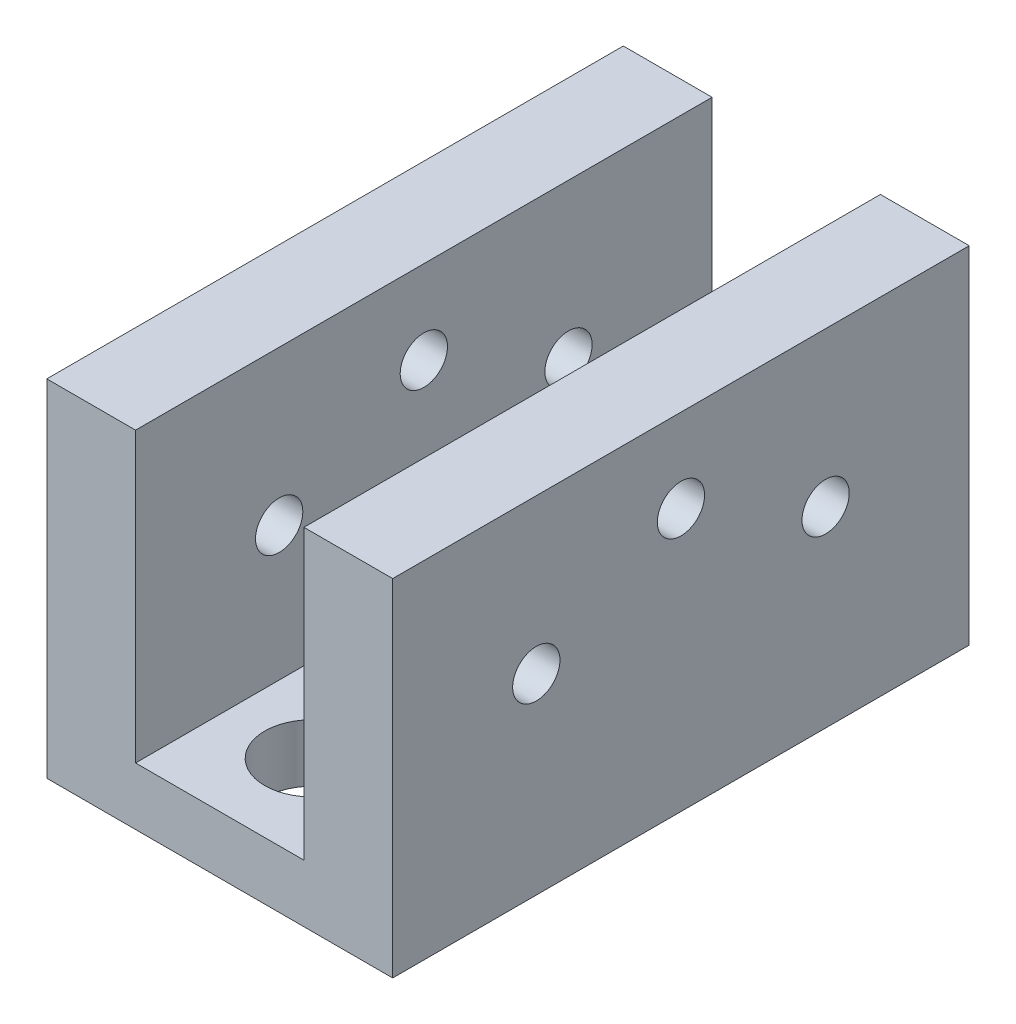
ISO-10303-21;
HEADER;
FILE_DESCRIPTION(('STEP AP214'),'2;1');
FILE_NAME('part.step','',(''),(''),'','','');
FILE_SCHEMA(('AUTOMOTIVE_DESIGN { 1 0 10303 214 1 1 1 1 }'));
ENDSEC;
DATA;
#1=APPLICATION_CONTEXT('core data for automotive mechanical design processes');
#2=APPLICATION_PROTOCOL_DEFINITION('international standard','automotive_design',2000,#1);
#3=PRODUCT_CONTEXT('',#1,'mechanical');
#4=PRODUCT('Part','Part','',(#3));
#5=PRODUCT_RELATED_PRODUCT_CATEGORY('part','',(#4));
#6=PRODUCT_DEFINITION_FORMATION('','',#4);
#7=PRODUCT_DEFINITION_CONTEXT('part definition',#1,'design');
#8=PRODUCT_DEFINITION('design','',#6,#7);
#9=PRODUCT_DEFINITION_SHAPE('','',#8);
#10=(LENGTH_UNIT() NAMED_UNIT(*) SI_UNIT(.MILLI.,.METRE.));
#11=(NAMED_UNIT(*) PLANE_ANGLE_UNIT() SI_UNIT($,.RADIAN.));
#12=(NAMED_UNIT(*) SI_UNIT($,.STERADIAN.) SOLID_ANGLE_UNIT());
#13=UNCERTAINTY_MEASURE_WITH_UNIT(LENGTH_MEASURE(1.E-05),#10,'distance_accuracy_value','');
#14=(GEOMETRIC_REPRESENTATION_CONTEXT(3) GLOBAL_UNCERTAINTY_ASSIGNED_CONTEXT((#13)) GLOBAL_UNIT_ASSIGNED_CONTEXT((#10,
#11,#12)) REPRESENTATION_CONTEXT('',''));
#15=CARTESIAN_POINT('',(0.,0.,0.));
#16=DIRECTION('',(0.,0.,1.));
#17=DIRECTION('',(1.,0.,0.));
#18=AXIS2_PLACEMENT_3D('',#15,#16,#17);
#19=CARTESIAN_POINT('',(0.,30.,0.));
#20=DIRECTION('',(0.,-1.,0.));
#21=DIRECTION('',(0.,0.,-1.));
#22=AXIS2_PLACEMENT_3D('',#19,#20,#21);
#23=PLANE('',#22);
#24=DIRECTION('',(-1.,0.,0.));
#25=VECTOR('',#24,1.);
#26=CARTESIAN_POINT('',(15.,30.,-25.));
#27=LINE('',#26,#25);
#28=CARTESIAN_POINT('',(15.,30.,-25.));
#29=VERTEX_POINT('',#28);
#30=CARTESIAN_POINT('',(7.3,30.,-25.));
#31=VERTEX_POINT('',#30);
#32=EDGE_CURVE('E219',#29,#31,#27,.T.);
#33=ORIENTED_EDGE('',*,*,#32,.T.);
#34=DIRECTION('',(0.,0.,-1.));
#35=VECTOR('',#34,1.);
#36=CARTESIAN_POINT('',(7.3,30.,25.));
#37=LINE('',#36,#35);
#38=CARTESIAN_POINT('',(7.3,30.,25.));
#39=VERTEX_POINT('',#38);
#40=EDGE_CURVE('E135',#39,#31,#37,.T.);
#41=ORIENTED_EDGE('',*,*,#40,.F.);
#42=DIRECTION('',(1.,0.,0.));
#43=VECTOR('',#42,1.);
#44=CARTESIAN_POINT('',(15.,30.,25.));
#45=LINE('',#44,#43);
#46=CARTESIAN_POINT('',(15.,30.,25.));
#47=VERTEX_POINT('',#46);
#48=EDGE_CURVE('E212',#39,#47,#45,.T.);
#49=ORIENTED_EDGE('',*,*,#48,.T.);
#50=DIRECTION('',(0.,0.,-1.));
#51=VECTOR('',#50,1.);
#52=CARTESIAN_POINT('',(15.,30.,-25.));
#53=LINE('',#52,#51);
#54=EDGE_CURVE('E215',#47,#29,#53,.T.);
#55=ORIENTED_EDGE('',*,*,#54,.T.);
#56=EDGE_LOOP('',(#33,#41,#49,#55));
#57=FACE_BOUND('',#56,.T.);
#58=ADVANCED_FACE('F45',(#57),#23,.F.);
#59=CARTESIAN_POINT('',(-15.,22.755,0.));
#60=DIRECTION('',(1.,0.,0.));
#61=DIRECTION('',(0.,0.,-1.));
#62=AXIS2_PLACEMENT_3D('',#59,#60,#61);
#63=CYLINDRICAL_SURFACE('',#62,2.05);
#64=CARTESIAN_POINT('',(7.3,22.755,0.));
#65=DIRECTION('',(1.,0.,0.));
#66=DIRECTION('',(0.,0.,-1.));
#67=AXIS2_PLACEMENT_3D('',#64,#65,#66);
#68=CIRCLE('',#67,2.05);
#69=CARTESIAN_POINT('',(7.3,22.755,-2.05));
#70=VERTEX_POINT('',#69);
#71=EDGE_CURVE('E49',#70,#70,#68,.F.);
#72=ORIENTED_EDGE('',*,*,#71,.T.);
#73=EDGE_LOOP('',(#72));
#74=FACE_BOUND('',#73,.T.);
#75=CARTESIAN_POINT('',(15.,22.755,0.));
#76=DIRECTION('',(1.,0.,0.));
#77=DIRECTION('',(0.,0.,-1.));
#78=AXIS2_PLACEMENT_3D('',#75,#76,#77);
#79=CIRCLE('',#78,2.05);
#80=CARTESIAN_POINT('',(15.,22.755,-2.05));
#81=VERTEX_POINT('',#80);
#82=EDGE_CURVE('E195',#81,#81,#79,.T.);
#83=ORIENTED_EDGE('',*,*,#82,.T.);
#84=EDGE_LOOP('',(#83));
#85=FACE_BOUND('',#84,.T.);
#86=ADVANCED_FACE('F322',(#74,#85),#63,.F.);
#87=CARTESIAN_POINT('',(0.,5.,0.));
#88=DIRECTION('',(0.,-1.,0.));
#89=DIRECTION('',(0.,0.,-1.));
#90=AXIS2_PLACEMENT_3D('',#87,#88,#89);
#91=PLANE('',#90);
#92=DIRECTION('',(-1.,0.,0.));
#93=VECTOR('',#92,1.);
#94=CARTESIAN_POINT('',(-15.,5.,-25.));
#95=LINE('',#94,#93);
#96=CARTESIAN_POINT('',(7.3,5.,-25.));
#97=VERTEX_POINT('',#96);
#98=CARTESIAN_POINT('',(-7.3,5.,-25.));
#99=VERTEX_POINT('',#98);
#100=EDGE_CURVE('E115',#97,#99,#95,.T.);
#101=ORIENTED_EDGE('',*,*,#100,.T.);
#102=DIRECTION('',(0.,0.,1.));
#103=VECTOR('',#102,1.);
#104=CARTESIAN_POINT('',(-7.3,5.,25.));
#105=LINE('',#104,#103);
#106=CARTESIAN_POINT('',(-7.3,5.,25.));
#107=VERTEX_POINT('',#106);
#108=EDGE_CURVE('E137',#99,#107,#105,.T.);
#109=ORIENTED_EDGE('',*,*,#108,.T.);
#110=DIRECTION('',(1.,0.,0.));
#111=VECTOR('',#110,1.);
#112=CARTESIAN_POINT('',(-15.,5.,25.));
#113=LINE('',#112,#111);
#114=CARTESIAN_POINT('',(7.3,5.,25.));
#115=VERTEX_POINT('',#114);
#116=EDGE_CURVE('E126',#107,#115,#113,.T.);
#117=ORIENTED_EDGE('',*,*,#116,.T.);
#118=DIRECTION('',(0.,0.,-1.));
#119=VECTOR('',#118,1.);
#120=CARTESIAN_POINT('',(7.3,5.,25.));
#121=LINE('',#120,#119);
#122=EDGE_CURVE('E132',#115,#97,#121,.T.);
#123=ORIENTED_EDGE('',*,*,#122,.T.);
#124=EDGE_LOOP('',(#101,#109,#117,#123));
#125=FACE_BOUND('',#124,.T.);
#126=CARTESIAN_POINT('',(0.,5.,17.));
#127=DIRECTION('',(0.,1.,0.));
#128=DIRECTION('',(0.,0.,1.));
#129=AXIS2_PLACEMENT_3D('',#126,#127,#128);
#130=CIRCLE('',#129,4.1);
#131=CARTESIAN_POINT('',(0.,5.,21.1));
#132=VERTEX_POINT('',#131);
#133=EDGE_CURVE('E223',#132,#132,#130,.T.);
#134=ORIENTED_EDGE('',*,*,#133,.F.);
#135=EDGE_LOOP('',(#134));
#136=FACE_BOUND('',#135,.T.);
#137=CARTESIAN_POINT('',(0.,5.,-17.));
#138=DIRECTION('',(0.,1.,0.));
#139=DIRECTION('',(0.,0.,1.));
#140=AXIS2_PLACEMENT_3D('',#137,#138,#139);
#141=CIRCLE('',#140,4.1);
#142=CARTESIAN_POINT('',(0.,5.,-12.9));
#143=VERTEX_POINT('',#142);
#144=EDGE_CURVE('E231',#143,#143,#141,.T.);
#145=ORIENTED_EDGE('',*,*,#144,.F.);
#146=EDGE_LOOP('',(#145));
#147=FACE_BOUND('',#146,.T.);
#148=ADVANCED_FACE('F139',(#125,#136,#147),#91,.F.);
#149=CARTESIAN_POINT('',(0.,0.,0.));
#150=DIRECTION('',(0.,-1.,0.));
#151=DIRECTION('',(0.,0.,-1.));
#152=AXIS2_PLACEMENT_3D('',#149,#150,#151);
#153=PLANE('',#152);
#154=CARTESIAN_POINT('',(0.,0.,-17.));
#155=DIRECTION('',(0.,1.,0.));
#156=DIRECTION('',(0.,0.,1.));
#157=AXIS2_PLACEMENT_3D('',#154,#155,#156);
#158=CIRCLE('',#157,4.1);
#159=CARTESIAN_POINT('',(0.,0.,-12.9));
#160=VERTEX_POINT('',#159);
#161=EDGE_CURVE('E227',#160,#160,#158,.T.);
#162=ORIENTED_EDGE('',*,*,#161,.T.);
#163=EDGE_LOOP('',(#162));
#164=FACE_BOUND('',#163,.T.);
#165=DIRECTION('',(0.,0.,-1.));
#166=VECTOR('',#165,1.);
#167=CARTESIAN_POINT('',(15.,0.,25.));
#168=LINE('',#167,#166);
#169=CARTESIAN_POINT('',(15.,0.,25.));
#170=VERTEX_POINT('',#169);
#171=CARTESIAN_POINT('',(15.,0.,-25.));
#172=VERTEX_POINT('',#171);
#173=EDGE_CURVE('E235',#170,#172,#168,.T.);
#174=ORIENTED_EDGE('',*,*,#173,.F.);
#175=DIRECTION('',(1.,0.,0.));
#176=VECTOR('',#175,1.);
#177=CARTESIAN_POINT('',(-15.,0.,25.));
#178=LINE('',#177,#176);
#179=CARTESIAN_POINT('',(-15.,0.,25.));
#180=VERTEX_POINT('',#179);
#181=EDGE_CURVE('E71',#180,#170,#178,.T.);
#182=ORIENTED_EDGE('',*,*,#181,.F.);
#183=DIRECTION('',(0.,0.,1.));
#184=VECTOR('',#183,1.);
#185=CARTESIAN_POINT('',(-15.,0.,25.));
#186=LINE('',#185,#184);
#187=CARTESIAN_POINT('',(-15.,0.,-25.));
#188=VERTEX_POINT('',#187);
#189=EDGE_CURVE('E248',#188,#180,#186,.T.);
#190=ORIENTED_EDGE('',*,*,#189,.F.);
#191=DIRECTION('',(-1.,0.,0.));
#192=VECTOR('',#191,1.);
#193=CARTESIAN_POINT('',(-15.,0.,-25.));
#194=LINE('',#193,#192);
#195=EDGE_CURVE('E245',#172,#188,#194,.T.);
#196=ORIENTED_EDGE('',*,*,#195,.F.);
#197=EDGE_LOOP('',(#174,#182,#190,#196));
#198=FACE_BOUND('',#197,.T.);
#199=CARTESIAN_POINT('',(0.,0.,17.));
#200=DIRECTION('',(0.,1.,0.));
#201=DIRECTION('',(0.,0.,1.));
#202=AXIS2_PLACEMENT_3D('',#199,#200,#201);
#203=CIRCLE('',#202,4.1);
#204=CARTESIAN_POINT('',(0.,0.,21.1));
#205=VERTEX_POINT('',#204);
#206=EDGE_CURVE('E222',#205,#205,#203,.T.);
#207=ORIENTED_EDGE('',*,*,#206,.T.);
#208=EDGE_LOOP('',(#207));
#209=FACE_BOUND('',#208,.T.);
#210=ADVANCED_FACE('F298',(#164,#198,#209),#153,.T.);
#211=CARTESIAN_POINT('',(15.,5.,25.));
#212=DIRECTION('',(-1.,0.,0.));
#213=DIRECTION('',(0.,0.,1.));
#214=AXIS2_PLACEMENT_3D('',#211,#212,#213);
#215=PLANE('',#214);
#216=CARTESIAN_POINT('',(15.,16.63,12.5452648304205));
#217=DIRECTION('',(1.,0.,0.));
#218=DIRECTION('',(0.,0.,-1.));
#219=AXIS2_PLACEMENT_3D('',#216,#217,#218);
#220=CIRCLE('',#219,2.05);
#221=CARTESIAN_POINT('',(15.,16.63,10.4952648304205));
#222=VERTEX_POINT('',#221);
#223=EDGE_CURVE('E183',#222,#222,#220,.T.);
#224=ORIENTED_EDGE('',*,*,#223,.F.);
#225=EDGE_LOOP('',(#224));
#226=FACE_BOUND('',#225,.T.);
#227=CARTESIAN_POINT('',(15.,16.63,-12.5452648304205));
#228=DIRECTION('',(1.,0.,0.));
#229=DIRECTION('',(0.,0.,-1.));
#230=AXIS2_PLACEMENT_3D('',#227,#228,#229);
#231=CIRCLE('',#230,2.05);
#232=CARTESIAN_POINT('',(15.,16.63,-14.5952648304205));
#233=VERTEX_POINT('',#232);
#234=EDGE_CURVE('E187',#233,#233,#231,.T.);
#235=ORIENTED_EDGE('',*,*,#234,.F.);
#236=EDGE_LOOP('',(#235));
#237=FACE_BOUND('',#236,.T.);
#238=ORIENTED_EDGE('',*,*,#82,.F.);
#239=EDGE_LOOP('',(#238));
#240=FACE_BOUND('',#239,.T.);
#241=ORIENTED_EDGE('',*,*,#173,.T.);
#242=DIRECTION('',(0.,-1.,0.));
#243=VECTOR('',#242,1.);
#244=CARTESIAN_POINT('',(15.,5.,-25.));
#245=LINE('',#244,#243);
#246=EDGE_CURVE('E11',#29,#172,#245,.T.);
#247=ORIENTED_EDGE('',*,*,#246,.F.);
#248=ORIENTED_EDGE('',*,*,#54,.F.);
#249=DIRECTION('',(0.,-1.,0.));
#250=VECTOR('',#249,1.);
#251=CARTESIAN_POINT('',(15.,5.,25.));
#252=LINE('',#251,#250);
#253=EDGE_CURVE('E241',#47,#170,#252,.T.);
#254=ORIENTED_EDGE('',*,*,#253,.T.);
#255=EDGE_LOOP('',(#241,#247,#248,#254));
#256=FACE_BOUND('',#255,.T.);
#257=ADVANCED_FACE('F47',(#226,#237,#240,#256),#215,.F.);
#258=CARTESIAN_POINT('',(-15.,5.,-25.));
#259=DIRECTION('',(0.,0.,1.));
#260=DIRECTION('',(1.,0.,0.));
#261=AXIS2_PLACEMENT_3D('',#258,#259,#260);
#262=PLANE('',#261);
#263=DIRECTION('',(-1.,0.,0.));
#264=VECTOR('',#263,1.);
#265=CARTESIAN_POINT('',(-15.,30.,-25.));
#266=LINE('',#265,#264);
#267=CARTESIAN_POINT('',(-7.3,30.,-25.));
#268=VERTEX_POINT('',#267);
#269=CARTESIAN_POINT('',(-15.,30.,-25.));
#270=VERTEX_POINT('',#269);
#271=EDGE_CURVE('E182',#268,#270,#266,.T.);
#272=ORIENTED_EDGE('',*,*,#271,.F.);
#273=DIRECTION('',(0.,1.,0.));
#274=VECTOR('',#273,1.);
#275=CARTESIAN_POINT('',(-7.3,5.,-25.));
#276=LINE('',#275,#274);
#277=EDGE_CURVE('E63',#99,#268,#276,.T.);
#278=ORIENTED_EDGE('',*,*,#277,.F.);
#279=ORIENTED_EDGE('',*,*,#100,.F.);
#280=DIRECTION('',(0.,1.,0.));
#281=VECTOR('',#280,1.);
#282=CARTESIAN_POINT('',(7.3,5.,-25.));
#283=LINE('',#282,#281);
#284=EDGE_CURVE('E120',#97,#31,#283,.T.);
#285=ORIENTED_EDGE('',*,*,#284,.T.);
#286=ORIENTED_EDGE('',*,*,#32,.F.);
#287=ORIENTED_EDGE('',*,*,#246,.T.);
#288=ORIENTED_EDGE('',*,*,#195,.T.);
#289=DIRECTION('',(0.,-1.,0.));
#290=VECTOR('',#289,1.);
#291=CARTESIAN_POINT('',(-15.,5.,-25.));
#292=LINE('',#291,#290);
#293=EDGE_CURVE('E55',#270,#188,#292,.T.);
#294=ORIENTED_EDGE('',*,*,#293,.F.);
#295=EDGE_LOOP('',(#272,#278,#279,#285,#286,#287,#288,#294));
#296=FACE_BOUND('',#295,.T.);
#297=ADVANCED_FACE('F118',(#296),#262,.F.);
#298=CARTESIAN_POINT('',(-15.,5.,25.));
#299=DIRECTION('',(1.,0.,0.));
#300=DIRECTION('',(0.,0.,-1.));
#301=AXIS2_PLACEMENT_3D('',#298,#299,#300);
#302=PLANE('',#301);
#303=CARTESIAN_POINT('',(-15.,16.63,12.5452648304205));
#304=DIRECTION('',(1.,0.,0.));
#305=DIRECTION('',(0.,0.,-1.));
#306=AXIS2_PLACEMENT_3D('',#303,#304,#305);
#307=CIRCLE('',#306,2.05);
#308=CARTESIAN_POINT('',(-15.,16.63,10.4952648304205));
#309=VERTEX_POINT('',#308);
#310=EDGE_CURVE('E178',#309,#309,#307,.T.);
#311=ORIENTED_EDGE('',*,*,#310,.T.);
#312=EDGE_LOOP('',(#311));
#313=FACE_BOUND('',#312,.T.);
#314=CARTESIAN_POINT('',(-15.,16.63,-12.5452648304205));
#315=DIRECTION('',(1.,0.,0.));
#316=DIRECTION('',(0.,0.,-1.));
#317=AXIS2_PLACEMENT_3D('',#314,#315,#316);
#318=CIRCLE('',#317,2.05);
#319=CARTESIAN_POINT('',(-15.,16.63,-14.5952648304205));
#320=VERTEX_POINT('',#319);
#321=EDGE_CURVE('E191',#320,#320,#318,.T.);
#322=ORIENTED_EDGE('',*,*,#321,.T.);
#323=EDGE_LOOP('',(#322));
#324=FACE_BOUND('',#323,.T.);
#325=CARTESIAN_POINT('',(-15.,22.755,0.));
#326=DIRECTION('',(1.,0.,0.));
#327=DIRECTION('',(0.,0.,-1.));
#328=AXIS2_PLACEMENT_3D('',#325,#326,#327);
#329=CIRCLE('',#328,2.05);
#330=CARTESIAN_POINT('',(-15.,22.755,-2.05));
#331=VERTEX_POINT('',#330);
#332=EDGE_CURVE('E177',#331,#331,#329,.T.);
#333=ORIENTED_EDGE('',*,*,#332,.T.);
#334=EDGE_LOOP('',(#333));
#335=FACE_BOUND('',#334,.T.);
#336=ORIENTED_EDGE('',*,*,#189,.T.);
#337=DIRECTION('',(0.,-1.,0.));
#338=VECTOR('',#337,1.);
#339=CARTESIAN_POINT('',(-15.,5.,25.));
#340=LINE('',#339,#338);
#341=CARTESIAN_POINT('',(-15.,30.,25.));
#342=VERTEX_POINT('',#341);
#343=EDGE_CURVE('E255',#342,#180,#340,.T.);
#344=ORIENTED_EDGE('',*,*,#343,.F.);
#345=DIRECTION('',(0.,0.,1.));
#346=VECTOR('',#345,1.);
#347=CARTESIAN_POINT('',(-15.,30.,-25.));
#348=LINE('',#347,#346);
#349=EDGE_CURVE('E204',#270,#342,#348,.T.);
#350=ORIENTED_EDGE('',*,*,#349,.F.);
#351=ORIENTED_EDGE('',*,*,#293,.T.);
#352=EDGE_LOOP('',(#336,#344,#350,#351));
#353=FACE_BOUND('',#352,.T.);
#354=ADVANCED_FACE('F282',(#313,#324,#335,#353),#302,.F.);
#355=CARTESIAN_POINT('',(-15.,5.,25.));
#356=DIRECTION('',(0.,0.,-1.));
#357=DIRECTION('',(-1.,0.,0.));
#358=AXIS2_PLACEMENT_3D('',#355,#356,#357);
#359=PLANE('',#358);
#360=ORIENTED_EDGE('',*,*,#48,.F.);
#361=DIRECTION('',(0.,1.,0.));
#362=VECTOR('',#361,1.);
#363=CARTESIAN_POINT('',(7.3,5.,25.));
#364=LINE('',#363,#362);
#365=EDGE_CURVE('E151',#115,#39,#364,.T.);
#366=ORIENTED_EDGE('',*,*,#365,.F.);
#367=ORIENTED_EDGE('',*,*,#116,.F.);
#368=DIRECTION('',(0.,1.,0.));
#369=VECTOR('',#368,1.);
#370=CARTESIAN_POINT('',(-7.3,5.,25.));
#371=LINE('',#370,#369);
#372=CARTESIAN_POINT('',(-7.3,30.,25.));
#373=VERTEX_POINT('',#372);
#374=EDGE_CURVE('E155',#107,#373,#371,.T.);
#375=ORIENTED_EDGE('',*,*,#374,.T.);
#376=DIRECTION('',(1.,0.,0.));
#377=VECTOR('',#376,1.);
#378=CARTESIAN_POINT('',(-15.,30.,25.));
#379=LINE('',#378,#377);
#380=EDGE_CURVE('E208',#342,#373,#379,.T.);
#381=ORIENTED_EDGE('',*,*,#380,.F.);
#382=ORIENTED_EDGE('',*,*,#343,.T.);
#383=ORIENTED_EDGE('',*,*,#181,.T.);
#384=ORIENTED_EDGE('',*,*,#253,.F.);
#385=EDGE_LOOP('',(#360,#366,#367,#375,#381,#382,#383,#384));
#386=FACE_BOUND('',#385,.T.);
#387=ADVANCED_FACE('F285',(#386),#359,.F.);
#388=CARTESIAN_POINT('',(0.,5.,-17.));
#389=DIRECTION('',(0.,-1.,0.));
#390=DIRECTION('',(0.,0.,-1.));
#391=AXIS2_PLACEMENT_3D('',#388,#389,#390);
#392=CYLINDRICAL_SURFACE('',#391,4.1);
#393=ORIENTED_EDGE('',*,*,#144,.T.);
#394=EDGE_LOOP('',(#393));
#395=FACE_BOUND('',#394,.T.);
#396=ORIENTED_EDGE('',*,*,#161,.F.);
#397=EDGE_LOOP('',(#396));
#398=FACE_BOUND('',#397,.T.);
#399=ADVANCED_FACE('F317',(#395,#398),#392,.F.);
#400=CARTESIAN_POINT('',(0.,5.,17.));
#401=DIRECTION('',(0.,-1.,0.));
#402=DIRECTION('',(0.,0.,-1.));
#403=AXIS2_PLACEMENT_3D('',#400,#401,#402);
#404=CYLINDRICAL_SURFACE('',#403,4.1);
#405=ORIENTED_EDGE('',*,*,#133,.T.);
#406=EDGE_LOOP('',(#405));
#407=FACE_BOUND('',#406,.T.);
#408=ORIENTED_EDGE('',*,*,#206,.F.);
#409=EDGE_LOOP('',(#408));
#410=FACE_BOUND('',#409,.T.);
#411=ADVANCED_FACE('F308',(#407,#410),#404,.F.);
#412=ORIENTED_EDGE('',*,*,#380,.T.);
#413=DIRECTION('',(0.,0.,1.));
#414=VECTOR('',#413,1.);
#415=CARTESIAN_POINT('',(-7.3,30.,25.));
#416=LINE('',#415,#414);
#417=EDGE_CURVE('E142',#268,#373,#416,.T.);
#418=ORIENTED_EDGE('',*,*,#417,.F.);
#419=ORIENTED_EDGE('',*,*,#271,.T.);
#420=ORIENTED_EDGE('',*,*,#349,.T.);
#421=EDGE_LOOP('',(#412,#418,#419,#420));
#422=FACE_BOUND('',#421,.T.);
#423=ADVANCED_FACE('F304',(#422),#23,.F.);
#424=CARTESIAN_POINT('',(-15.,16.63,-12.5452648304205));
#425=DIRECTION('',(1.,0.,0.));
#426=DIRECTION('',(0.,0.,-1.));
#427=AXIS2_PLACEMENT_3D('',#424,#425,#426);
#428=CYLINDRICAL_SURFACE('',#427,2.05);
#429=CARTESIAN_POINT('',(7.3,16.63,-12.5452648304205));
#430=DIRECTION('',(1.,0.,0.));
#431=DIRECTION('',(0.,0.,-1.));
#432=AXIS2_PLACEMENT_3D('',#429,#430,#431);
#433=CIRCLE('',#432,2.05);
#434=CARTESIAN_POINT('',(7.3,16.63,-14.5952648304205));
#435=VERTEX_POINT('',#434);
#436=EDGE_CURVE('E173',#435,#435,#433,.F.);
#437=ORIENTED_EDGE('',*,*,#436,.T.);
#438=EDGE_LOOP('',(#437));
#439=FACE_BOUND('',#438,.T.);
#440=ORIENTED_EDGE('',*,*,#234,.T.);
#441=EDGE_LOOP('',(#440));
#442=FACE_BOUND('',#441,.T.);
#443=ADVANCED_FACE('F307',(#439,#442),#428,.F.);
#444=CARTESIAN_POINT('',(-15.,16.63,12.5452648304205));
#445=DIRECTION('',(1.,0.,0.));
#446=DIRECTION('',(0.,0.,-1.));
#447=AXIS2_PLACEMENT_3D('',#444,#445,#446);
#448=CYLINDRICAL_SURFACE('',#447,2.05);
#449=CARTESIAN_POINT('',(7.3,16.63,12.5452648304205));
#450=DIRECTION('',(1.,0.,0.));
#451=DIRECTION('',(0.,0.,-1.));
#452=AXIS2_PLACEMENT_3D('',#449,#450,#451);
#453=CIRCLE('',#452,2.05);
#454=CARTESIAN_POINT('',(7.3,16.63,10.4952648304205));
#455=VERTEX_POINT('',#454);
#456=EDGE_CURVE('E169',#455,#455,#453,.F.);
#457=ORIENTED_EDGE('',*,*,#456,.T.);
#458=EDGE_LOOP('',(#457));
#459=FACE_BOUND('',#458,.T.);
#460=ORIENTED_EDGE('',*,*,#223,.T.);
#461=EDGE_LOOP('',(#460));
#462=FACE_BOUND('',#461,.T.);
#463=ADVANCED_FACE('F278',(#459,#462),#448,.F.);
#464=CARTESIAN_POINT('',(-7.3,16.63,12.5452648304205));
#465=DIRECTION('',(-1.,0.,0.));
#466=DIRECTION('',(0.,0.,1.));
#467=AXIS2_PLACEMENT_3D('',#464,#465,#466);
#468=CIRCLE('',#467,2.05);
#469=CARTESIAN_POINT('',(-7.3,16.63,14.5952648304205));
#470=VERTEX_POINT('',#469);
#471=EDGE_CURVE('E165',#470,#470,#468,.F.);
#472=ORIENTED_EDGE('',*,*,#471,.T.);
#473=EDGE_LOOP('',(#472));
#474=FACE_BOUND('',#473,.T.);
#475=ORIENTED_EDGE('',*,*,#310,.F.);
#476=EDGE_LOOP('',(#475));
#477=FACE_BOUND('',#476,.T.);
#478=ADVANCED_FACE('F274',(#474,#477),#448,.F.);
#479=CARTESIAN_POINT('',(-7.3,16.63,-12.5452648304205));
#480=DIRECTION('',(-1.,0.,0.));
#481=DIRECTION('',(0.,0.,1.));
#482=AXIS2_PLACEMENT_3D('',#479,#480,#481);
#483=CIRCLE('',#482,2.05);
#484=CARTESIAN_POINT('',(-7.3,16.63,-10.4952648304205));
#485=VERTEX_POINT('',#484);
#486=EDGE_CURVE('E161',#485,#485,#483,.F.);
#487=ORIENTED_EDGE('',*,*,#486,.T.);
#488=EDGE_LOOP('',(#487));
#489=FACE_BOUND('',#488,.T.);
#490=ORIENTED_EDGE('',*,*,#321,.F.);
#491=EDGE_LOOP('',(#490));
#492=FACE_BOUND('',#491,.T.);
#493=ADVANCED_FACE('F277',(#489,#492),#428,.F.);
#494=CARTESIAN_POINT('',(-7.3,22.755,0.));
#495=DIRECTION('',(-1.,0.,0.));
#496=DIRECTION('',(0.,0.,1.));
#497=AXIS2_PLACEMENT_3D('',#494,#495,#496);
#498=CIRCLE('',#497,2.05);
#499=CARTESIAN_POINT('',(-7.3,22.755,2.05));
#500=VERTEX_POINT('',#499);
#501=EDGE_CURVE('E154',#500,#500,#498,.F.);
#502=ORIENTED_EDGE('',*,*,#501,.T.);
#503=EDGE_LOOP('',(#502));
#504=FACE_BOUND('',#503,.T.);
#505=ORIENTED_EDGE('',*,*,#332,.F.);
#506=EDGE_LOOP('',(#505));
#507=FACE_BOUND('',#506,.T.);
#508=ADVANCED_FACE('F264',(#504,#507),#63,.F.);
#509=CARTESIAN_POINT('',(7.3,5.,25.));
#510=DIRECTION('',(1.,0.,0.));
#511=DIRECTION('',(0.,0.,-1.));
#512=AXIS2_PLACEMENT_3D('',#509,#510,#511);
#513=PLANE('',#512);
#514=ORIENTED_EDGE('',*,*,#456,.F.);
#515=EDGE_LOOP('',(#514));
#516=FACE_BOUND('',#515,.T.);
#517=ORIENTED_EDGE('',*,*,#40,.T.);
#518=ORIENTED_EDGE('',*,*,#284,.F.);
#519=ORIENTED_EDGE('',*,*,#122,.F.);
#520=ORIENTED_EDGE('',*,*,#365,.T.);
#521=EDGE_LOOP('',(#517,#518,#519,#520));
#522=FACE_BOUND('',#521,.T.);
#523=ORIENTED_EDGE('',*,*,#71,.F.);
#524=EDGE_LOOP('',(#523));
#525=FACE_BOUND('',#524,.T.);
#526=ORIENTED_EDGE('',*,*,#436,.F.);
#527=EDGE_LOOP('',(#526));
#528=FACE_BOUND('',#527,.T.);
#529=ADVANCED_FACE('F130',(#516,#522,#525,#528),#513,.F.);
#530=CARTESIAN_POINT('',(-7.3,5.,25.));
#531=DIRECTION('',(-1.,0.,0.));
#532=DIRECTION('',(0.,0.,1.));
#533=AXIS2_PLACEMENT_3D('',#530,#531,#532);
#534=PLANE('',#533);
#535=ORIENTED_EDGE('',*,*,#486,.F.);
#536=EDGE_LOOP('',(#535));
#537=FACE_BOUND('',#536,.T.);
#538=ORIENTED_EDGE('',*,*,#417,.T.);
#539=ORIENTED_EDGE('',*,*,#374,.F.);
#540=ORIENTED_EDGE('',*,*,#108,.F.);
#541=ORIENTED_EDGE('',*,*,#277,.T.);
#542=EDGE_LOOP('',(#538,#539,#540,#541));
#543=FACE_BOUND('',#542,.T.);
#544=ORIENTED_EDGE('',*,*,#501,.F.);
#545=EDGE_LOOP('',(#544));
#546=FACE_BOUND('',#545,.T.);
#547=ORIENTED_EDGE('',*,*,#471,.F.);
#548=EDGE_LOOP('',(#547));
#549=FACE_BOUND('',#548,.T.);
#550=ADVANCED_FACE('F267',(#537,#543,#546,#549),#534,.F.);
#551=CLOSED_SHELL('',(#58,#86,#148,#210,#257,#297,#354,#387,#399,#411,#423,#443,#463,#478,#493,
#508,#529,#550));
#552=MANIFOLD_SOLID_BREP('B2',#551);
#553=ADVANCED_BREP_SHAPE_REPRESENTATION('',(#18,#552),#14);
#554=SHAPE_DEFINITION_REPRESENTATION(#9,#553);
ENDSEC;
END-ISO-10303-21;
